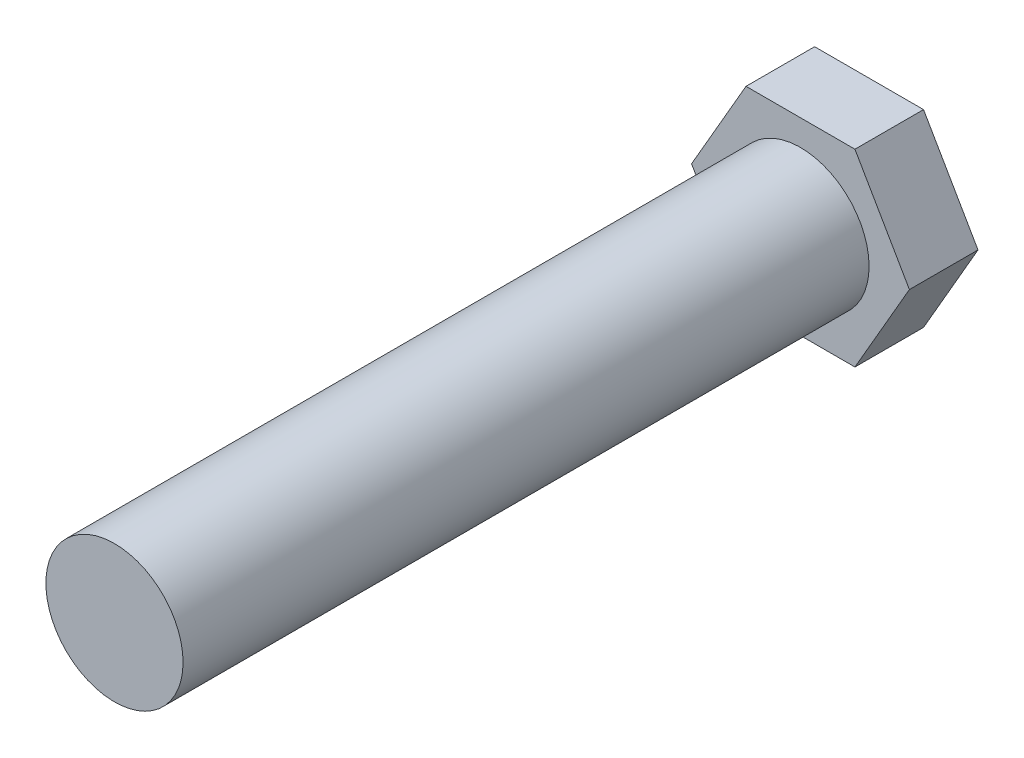
ISO-10303-21;
HEADER;
FILE_DESCRIPTION(('STEP AP214'),'2;1');
FILE_NAME('part.step','',(''),(''),'','','');
FILE_SCHEMA(('AUTOMOTIVE_DESIGN { 1 0 10303 214 1 1 1 1 }'));
ENDSEC;
DATA;
#1=APPLICATION_CONTEXT('core data for automotive mechanical design processes');
#2=APPLICATION_PROTOCOL_DEFINITION('international standard','automotive_design',2000,#1);
#3=PRODUCT_CONTEXT('',#1,'mechanical');
#4=PRODUCT('Part','Part','',(#3));
#5=PRODUCT_RELATED_PRODUCT_CATEGORY('part','',(#4));
#6=PRODUCT_DEFINITION_FORMATION('','',#4);
#7=PRODUCT_DEFINITION_CONTEXT('part definition',#1,'design');
#8=PRODUCT_DEFINITION('design','',#6,#7);
#9=PRODUCT_DEFINITION_SHAPE('','',#8);
#10=(LENGTH_UNIT() NAMED_UNIT(*) SI_UNIT(.MILLI.,.METRE.));
#11=(NAMED_UNIT(*) PLANE_ANGLE_UNIT() SI_UNIT($,.RADIAN.));
#12=(NAMED_UNIT(*) SI_UNIT($,.STERADIAN.) SOLID_ANGLE_UNIT());
#13=UNCERTAINTY_MEASURE_WITH_UNIT(LENGTH_MEASURE(1.E-05),#10,'distance_accuracy_value','');
#14=(GEOMETRIC_REPRESENTATION_CONTEXT(3) GLOBAL_UNCERTAINTY_ASSIGNED_CONTEXT((#13)) GLOBAL_UNIT_ASSIGNED_CONTEXT((#10,
#11,#12)) REPRESENTATION_CONTEXT('',''));
#15=CARTESIAN_POINT('',(0.,0.,0.));
#16=DIRECTION('',(0.,0.,1.));
#17=DIRECTION('',(1.,0.,0.));
#18=AXIS2_PLACEMENT_3D('',#15,#16,#17);
#19=CARTESIAN_POINT('',(4.03279163028954,-6.98500000000001,5.08));
#20=DIRECTION('',(-0.866025403784439,0.5,0.));
#21=DIRECTION('',(-0.5,-0.866025403784439,0.));
#22=AXIS2_PLACEMENT_3D('',#19,#20,#21);
#23=PLANE('',#22);
#24=DIRECTION('',(0.5,0.866025403784439,0.));
#25=VECTOR('',#24,1.);
#26=CARTESIAN_POINT('',(4.03279163028954,-6.98500000000001,0.));
#27=LINE('',#26,#25);
#28=CARTESIAN_POINT('',(4.03279163028954,-6.98500000000001,0.));
#29=VERTEX_POINT('',#28);
#30=CARTESIAN_POINT('',(8.06558326057907,0.,0.));
#31=VERTEX_POINT('',#30);
#32=EDGE_CURVE('E125',#29,#31,#27,.T.);
#33=ORIENTED_EDGE('',*,*,#32,.T.);
#34=DIRECTION('',(0.,0.,-1.));
#35=VECTOR('',#34,1.);
#36=CARTESIAN_POINT('',(8.06558326057907,0.,5.08));
#37=LINE('',#36,#35);
#38=CARTESIAN_POINT('',(8.06558326057907,0.,5.08));
#39=VERTEX_POINT('',#38);
#40=EDGE_CURVE('E11',#39,#31,#37,.T.);
#41=ORIENTED_EDGE('',*,*,#40,.F.);
#42=DIRECTION('',(0.5,0.866025403784439,0.));
#43=VECTOR('',#42,1.);
#44=CARTESIAN_POINT('',(4.03279163028954,-6.98500000000001,5.08));
#45=LINE('',#44,#43);
#46=CARTESIAN_POINT('',(4.03279163028954,-6.98500000000001,5.08));
#47=VERTEX_POINT('',#46);
#48=EDGE_CURVE('E136',#47,#39,#45,.T.);
#49=ORIENTED_EDGE('',*,*,#48,.F.);
#50=DIRECTION('',(0.,0.,-1.));
#51=VECTOR('',#50,1.);
#52=CARTESIAN_POINT('',(4.03279163028954,-6.98500000000001,5.08));
#53=LINE('',#52,#51);
#54=EDGE_CURVE('E121',#47,#29,#53,.T.);
#55=ORIENTED_EDGE('',*,*,#54,.T.);
#56=EDGE_LOOP('',(#33,#41,#49,#55));
#57=FACE_BOUND('',#56,.T.);
#58=ADVANCED_FACE('F41',(#57),#23,.F.);
#59=CARTESIAN_POINT('',(8.06558326057907,0.,5.08));
#60=DIRECTION('',(-0.866025403784439,-0.5,0.));
#61=DIRECTION('',(0.5,-0.866025403784439,0.));
#62=AXIS2_PLACEMENT_3D('',#59,#60,#61);
#63=PLANE('',#62);
#64=DIRECTION('',(-0.5,0.866025403784439,0.));
#65=VECTOR('',#64,1.);
#66=CARTESIAN_POINT('',(8.06558326057907,0.,0.));
#67=LINE('',#66,#65);
#68=CARTESIAN_POINT('',(4.03279163028954,6.985,0.));
#69=VERTEX_POINT('',#68);
#70=EDGE_CURVE('E128',#31,#69,#67,.T.);
#71=ORIENTED_EDGE('',*,*,#70,.T.);
#72=DIRECTION('',(0.,0.,-1.));
#73=VECTOR('',#72,1.);
#74=CARTESIAN_POINT('',(4.03279163028954,6.985,5.08));
#75=LINE('',#74,#73);
#76=CARTESIAN_POINT('',(4.03279163028954,6.985,5.08));
#77=VERTEX_POINT('',#76);
#78=EDGE_CURVE('E49',#77,#69,#75,.T.);
#79=ORIENTED_EDGE('',*,*,#78,.F.);
#80=DIRECTION('',(-0.5,0.866025403784439,0.));
#81=VECTOR('',#80,1.);
#82=CARTESIAN_POINT('',(8.06558326057907,0.,5.08));
#83=LINE('',#82,#81);
#84=EDGE_CURVE('E94',#39,#77,#83,.T.);
#85=ORIENTED_EDGE('',*,*,#84,.F.);
#86=ORIENTED_EDGE('',*,*,#40,.T.);
#87=EDGE_LOOP('',(#71,#79,#85,#86));
#88=FACE_BOUND('',#87,.T.);
#89=ADVANCED_FACE('F161',(#88),#63,.F.);
#90=CARTESIAN_POINT('',(4.03279163028954,6.985,5.08));
#91=DIRECTION('',(0.,-1.,0.));
#92=DIRECTION('',(1.,0.,0.));
#93=AXIS2_PLACEMENT_3D('',#90,#91,#92);
#94=PLANE('',#93);
#95=DIRECTION('',(-1.,0.,0.));
#96=VECTOR('',#95,1.);
#97=CARTESIAN_POINT('',(4.03279163028954,6.985,0.));
#98=LINE('',#97,#96);
#99=CARTESIAN_POINT('',(-4.03279163028953,6.98500000000001,0.));
#100=VERTEX_POINT('',#99);
#101=EDGE_CURVE('E131',#69,#100,#98,.T.);
#102=ORIENTED_EDGE('',*,*,#101,.T.);
#103=DIRECTION('',(0.,0.,-1.));
#104=VECTOR('',#103,1.);
#105=CARTESIAN_POINT('',(-4.03279163028953,6.98500000000001,5.08));
#106=LINE('',#105,#104);
#107=CARTESIAN_POINT('',(-4.03279163028953,6.98500000000001,5.08));
#108=VERTEX_POINT('',#107);
#109=EDGE_CURVE('E116',#108,#100,#106,.T.);
#110=ORIENTED_EDGE('',*,*,#109,.F.);
#111=DIRECTION('',(-1.,0.,0.));
#112=VECTOR('',#111,1.);
#113=CARTESIAN_POINT('',(4.03279163028954,6.985,5.08));
#114=LINE('',#113,#112);
#115=EDGE_CURVE('E107',#77,#108,#114,.T.);
#116=ORIENTED_EDGE('',*,*,#115,.F.);
#117=ORIENTED_EDGE('',*,*,#78,.T.);
#118=EDGE_LOOP('',(#102,#110,#116,#117));
#119=FACE_BOUND('',#118,.T.);
#120=ADVANCED_FACE('F142',(#119),#94,.F.);
#121=CARTESIAN_POINT('',(-4.03279163028953,6.98500000000001,5.08));
#122=DIRECTION('',(0.866025403784439,-0.5,0.));
#123=DIRECTION('',(0.5,0.866025403784438,0.));
#124=AXIS2_PLACEMENT_3D('',#121,#122,#123);
#125=PLANE('',#124);
#126=DIRECTION('',(-0.5,-0.866025403784438,0.));
#127=VECTOR('',#126,1.);
#128=CARTESIAN_POINT('',(-4.03279163028953,6.98500000000001,0.));
#129=LINE('',#128,#127);
#130=CARTESIAN_POINT('',(-8.06558326057908,0.,0.));
#131=VERTEX_POINT('',#130);
#132=EDGE_CURVE('E115',#100,#131,#129,.T.);
#133=ORIENTED_EDGE('',*,*,#132,.T.);
#134=DIRECTION('',(0.,0.,-1.));
#135=VECTOR('',#134,1.);
#136=CARTESIAN_POINT('',(-8.06558326057908,0.,5.08));
#137=LINE('',#136,#135);
#138=CARTESIAN_POINT('',(-8.06558326057908,0.,5.08));
#139=VERTEX_POINT('',#138);
#140=EDGE_CURVE('E112',#139,#131,#137,.T.);
#141=ORIENTED_EDGE('',*,*,#140,.F.);
#142=DIRECTION('',(-0.5,-0.866025403784438,0.));
#143=VECTOR('',#142,1.);
#144=CARTESIAN_POINT('',(-4.03279163028953,6.98500000000001,5.08));
#145=LINE('',#144,#143);
#146=EDGE_CURVE('E101',#108,#139,#145,.T.);
#147=ORIENTED_EDGE('',*,*,#146,.F.);
#148=ORIENTED_EDGE('',*,*,#109,.T.);
#149=EDGE_LOOP('',(#133,#141,#147,#148));
#150=FACE_BOUND('',#149,.T.);
#151=ADVANCED_FACE('F113',(#150),#125,.F.);
#152=CARTESIAN_POINT('',(-8.06558326057908,0.,5.08));
#153=DIRECTION('',(0.866025403784439,0.5,0.));
#154=DIRECTION('',(-0.5,0.866025403784439,0.));
#155=AXIS2_PLACEMENT_3D('',#152,#153,#154);
#156=PLANE('',#155);
#157=DIRECTION('',(0.5,-0.866025403784439,0.));
#158=VECTOR('',#157,1.);
#159=CARTESIAN_POINT('',(-8.06558326057908,0.,0.));
#160=LINE('',#159,#158);
#161=CARTESIAN_POINT('',(-4.03279163028954,-6.985,0.));
#162=VERTEX_POINT('',#161);
#163=EDGE_CURVE('E80',#131,#162,#160,.T.);
#164=ORIENTED_EDGE('',*,*,#163,.T.);
#165=DIRECTION('',(0.,0.,-1.));
#166=VECTOR('',#165,1.);
#167=CARTESIAN_POINT('',(-4.03279163028954,-6.985,5.08));
#168=LINE('',#167,#166);
#169=CARTESIAN_POINT('',(-4.03279163028954,-6.985,5.08));
#170=VERTEX_POINT('',#169);
#171=EDGE_CURVE('E117',#170,#162,#168,.T.);
#172=ORIENTED_EDGE('',*,*,#171,.F.);
#173=DIRECTION('',(0.5,-0.866025403784439,0.));
#174=VECTOR('',#173,1.);
#175=CARTESIAN_POINT('',(-8.06558326057908,0.,5.08));
#176=LINE('',#175,#174);
#177=EDGE_CURVE('E105',#139,#170,#176,.T.);
#178=ORIENTED_EDGE('',*,*,#177,.F.);
#179=ORIENTED_EDGE('',*,*,#140,.T.);
#180=EDGE_LOOP('',(#164,#172,#178,#179));
#181=FACE_BOUND('',#180,.T.);
#182=ADVANCED_FACE('F119',(#181),#156,.F.);
#183=CARTESIAN_POINT('',(-4.03279163028954,-6.985,5.08));
#184=DIRECTION('',(0.,1.,0.));
#185=DIRECTION('',(-1.,0.,0.));
#186=AXIS2_PLACEMENT_3D('',#183,#184,#185);
#187=PLANE('',#186);
#188=DIRECTION('',(1.,0.,0.));
#189=VECTOR('',#188,1.);
#190=CARTESIAN_POINT('',(-4.03279163028954,-6.985,0.));
#191=LINE('',#190,#189);
#192=EDGE_CURVE('E86',#162,#29,#191,.T.);
#193=ORIENTED_EDGE('',*,*,#192,.T.);
#194=ORIENTED_EDGE('',*,*,#54,.F.);
#195=DIRECTION('',(1.,0.,0.));
#196=VECTOR('',#195,1.);
#197=CARTESIAN_POINT('',(-4.03279163028954,-6.985,5.08));
#198=LINE('',#197,#196);
#199=EDGE_CURVE('E57',#170,#47,#198,.T.);
#200=ORIENTED_EDGE('',*,*,#199,.F.);
#201=ORIENTED_EDGE('',*,*,#171,.T.);
#202=EDGE_LOOP('',(#193,#194,#200,#201));
#203=FACE_BOUND('',#202,.T.);
#204=ADVANCED_FACE('F149',(#203),#187,.F.);
#205=CARTESIAN_POINT('',(0.,0.,5.08));
#206=DIRECTION('',(0.,0.,1.));
#207=DIRECTION('',(1.,0.,0.));
#208=AXIS2_PLACEMENT_3D('',#205,#206,#207);
#209=PLANE('',#208);
#210=CARTESIAN_POINT('',(0.,0.,5.08));
#211=DIRECTION('',(0.,0.,1.));
#212=DIRECTION('',(1.,0.,0.));
#213=AXIS2_PLACEMENT_3D('',#210,#211,#212);
#214=CIRCLE('',#213,5.08);
#215=CARTESIAN_POINT('',(5.08,0.,5.08));
#216=VERTEX_POINT('',#215);
#217=EDGE_CURVE('E222',#216,#216,#214,.T.);
#218=ORIENTED_EDGE('',*,*,#217,.F.);
#219=EDGE_LOOP('',(#218));
#220=FACE_BOUND('',#219,.T.);
#221=ORIENTED_EDGE('',*,*,#48,.T.);
#222=ORIENTED_EDGE('',*,*,#84,.T.);
#223=ORIENTED_EDGE('',*,*,#115,.T.);
#224=ORIENTED_EDGE('',*,*,#146,.T.);
#225=ORIENTED_EDGE('',*,*,#177,.T.);
#226=ORIENTED_EDGE('',*,*,#199,.T.);
#227=EDGE_LOOP('',(#221,#222,#223,#224,#225,#226));
#228=FACE_BOUND('',#227,.T.);
#229=ADVANCED_FACE('F103',(#220,#228),#209,.T.);
#230=CARTESIAN_POINT('',(0.,0.,0.));
#231=DIRECTION('',(0.,0.,1.));
#232=DIRECTION('',(1.,0.,0.));
#233=AXIS2_PLACEMENT_3D('',#230,#231,#232);
#234=PLANE('',#233);
#235=ORIENTED_EDGE('',*,*,#32,.F.);
#236=ORIENTED_EDGE('',*,*,#192,.F.);
#237=ORIENTED_EDGE('',*,*,#163,.F.);
#238=ORIENTED_EDGE('',*,*,#132,.F.);
#239=ORIENTED_EDGE('',*,*,#101,.F.);
#240=ORIENTED_EDGE('',*,*,#70,.F.);
#241=EDGE_LOOP('',(#235,#236,#237,#238,#239,#240));
#242=FACE_BOUND('',#241,.T.);
#243=ADVANCED_FACE('F145',(#242),#234,.F.);
#244=CARTESIAN_POINT('',(0.,0.,55.88));
#245=DIRECTION('',(0.,0.,-1.));
#246=DIRECTION('',(-1.,0.,0.));
#247=AXIS2_PLACEMENT_3D('',#244,#245,#246);
#248=CYLINDRICAL_SURFACE('',#247,5.08);
#249=CARTESIAN_POINT('',(0.,0.,55.88));
#250=DIRECTION('',(0.,0.,1.));
#251=DIRECTION('',(1.,0.,0.));
#252=AXIS2_PLACEMENT_3D('',#249,#250,#251);
#253=CIRCLE('',#252,5.08);
#254=CARTESIAN_POINT('',(5.08,0.,55.88));
#255=VERTEX_POINT('',#254);
#256=EDGE_CURVE('E129',#255,#255,#253,.T.);
#257=ORIENTED_EDGE('',*,*,#256,.F.);
#258=EDGE_LOOP('',(#257));
#259=FACE_BOUND('',#258,.T.);
#260=ORIENTED_EDGE('',*,*,#217,.T.);
#261=EDGE_LOOP('',(#260));
#262=FACE_BOUND('',#261,.T.);
#263=ADVANCED_FACE('F193',(#259,#262),#248,.T.);
#264=CARTESIAN_POINT('',(0.,0.,55.88));
#265=DIRECTION('',(0.,0.,1.));
#266=DIRECTION('',(1.,0.,0.));
#267=AXIS2_PLACEMENT_3D('',#264,#265,#266);
#268=PLANE('',#267);
#269=ORIENTED_EDGE('',*,*,#256,.T.);
#270=EDGE_LOOP('',(#269));
#271=FACE_BOUND('',#270,.T.);
#272=ADVANCED_FACE('F206',(#271),#268,.T.);
#273=CLOSED_SHELL('',(#58,#89,#120,#151,#182,#204,#229,#243,#263,#272));
#274=MANIFOLD_SOLID_BREP('B2',#273);
#275=ADVANCED_BREP_SHAPE_REPRESENTATION('',(#18,#274),#14);
#276=SHAPE_DEFINITION_REPRESENTATION(#9,#275);
ENDSEC;
END-ISO-10303-21;
